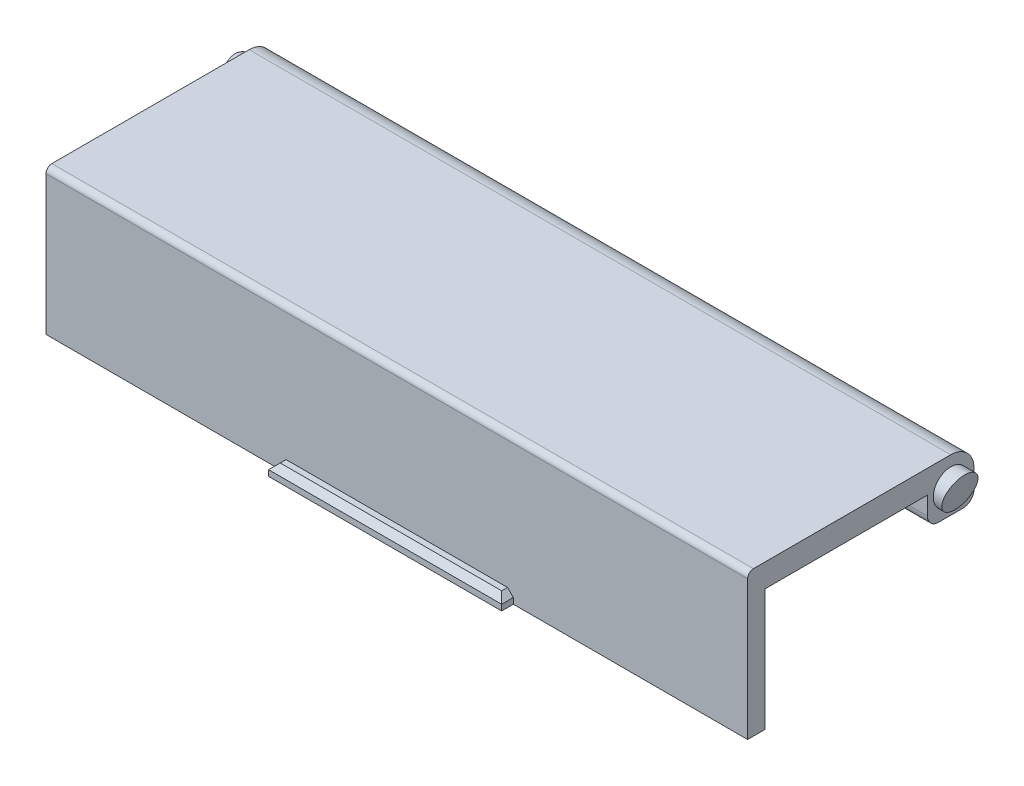
ISO-10303-21;
HEADER;
FILE_DESCRIPTION(('STEP AP214'),'2;1');
FILE_NAME('part.step','',(''),(''),'','','');
FILE_SCHEMA(('AUTOMOTIVE_DESIGN { 1 0 10303 214 1 1 1 1 }'));
ENDSEC;
DATA;
#1=APPLICATION_CONTEXT('core data for automotive mechanical design processes');
#2=APPLICATION_PROTOCOL_DEFINITION('international standard','automotive_design',2000,#1);
#3=PRODUCT_CONTEXT('',#1,'mechanical');
#4=PRODUCT('Part','Part','',(#3));
#5=PRODUCT_RELATED_PRODUCT_CATEGORY('part','',(#4));
#6=PRODUCT_DEFINITION_FORMATION('','',#4);
#7=PRODUCT_DEFINITION_CONTEXT('part definition',#1,'design');
#8=PRODUCT_DEFINITION('design','',#6,#7);
#9=PRODUCT_DEFINITION_SHAPE('','',#8);
#10=(LENGTH_UNIT() NAMED_UNIT(*) SI_UNIT(.MILLI.,.METRE.));
#11=(NAMED_UNIT(*) PLANE_ANGLE_UNIT() SI_UNIT($,.RADIAN.));
#12=(NAMED_UNIT(*) SI_UNIT($,.STERADIAN.) SOLID_ANGLE_UNIT());
#13=UNCERTAINTY_MEASURE_WITH_UNIT(LENGTH_MEASURE(1.E-05),#10,'distance_accuracy_value','');
#14=(GEOMETRIC_REPRESENTATION_CONTEXT(3) GLOBAL_UNCERTAINTY_ASSIGNED_CONTEXT((#13)) GLOBAL_UNIT_ASSIGNED_CONTEXT((#10,
#11,#12)) REPRESENTATION_CONTEXT('',''));
#15=CARTESIAN_POINT('',(0.,0.,0.));
#16=DIRECTION('',(0.,0.,1.));
#17=DIRECTION('',(1.,0.,0.));
#18=AXIS2_PLACEMENT_3D('',#15,#16,#17);
#19=CARTESIAN_POINT('',(30.099,-10.446,1.5));
#20=DIRECTION('',(0.,1.,0.));
#21=DIRECTION('',(0.,0.,1.));
#22=AXIS2_PLACEMENT_3D('',#19,#20,#21);
#23=PLANE('',#22);
#24=DIRECTION('',(0.,0.,-1.));
#25=VECTOR('',#24,1.);
#26=CARTESIAN_POINT('',(-30.099,-10.446,1.5));
#27=LINE('',#26,#25);
#28=CARTESIAN_POINT('',(-30.099,-10.446,1.5));
#29=VERTEX_POINT('',#28);
#30=CARTESIAN_POINT('',(-30.099,-10.446,0.));
#31=VERTEX_POINT('',#30);
#32=EDGE_CURVE('E214',#29,#31,#27,.T.);
#33=ORIENTED_EDGE('',*,*,#32,.T.);
#34=DIRECTION('',(-1.,0.,0.));
#35=VECTOR('',#34,1.);
#36=CARTESIAN_POINT('',(30.099,-10.446,0.));
#37=LINE('',#36,#35);
#38=CARTESIAN_POINT('',(30.099,-10.446,0.));
#39=VERTEX_POINT('',#38);
#40=EDGE_CURVE('E270',#39,#31,#37,.T.);
#41=ORIENTED_EDGE('',*,*,#40,.F.);
#42=DIRECTION('',(0.,0.,-1.));
#43=VECTOR('',#42,1.);
#44=CARTESIAN_POINT('',(30.099,-10.446,1.5));
#45=LINE('',#44,#43);
#46=CARTESIAN_POINT('',(30.099,-10.446,1.5));
#47=VERTEX_POINT('',#46);
#48=EDGE_CURVE('E215',#47,#39,#45,.T.);
#49=ORIENTED_EDGE('',*,*,#48,.F.);
#50=DIRECTION('',(-1.,0.,0.));
#51=VECTOR('',#50,1.);
#52=CARTESIAN_POINT('',(30.099,-10.446,1.5));
#53=LINE('',#52,#51);
#54=CARTESIAN_POINT('',(10.,-10.446,1.5));
#55=VERTEX_POINT('',#54);
#56=EDGE_CURVE('E189',#47,#55,#53,.T.);
#57=ORIENTED_EDGE('',*,*,#56,.T.);
#58=DIRECTION('',(0.,0.,-1.));
#59=VECTOR('',#58,1.);
#60=CARTESIAN_POINT('',(10.,-10.446,1.5));
#61=LINE('',#60,#59);
#62=CARTESIAN_POINT('',(10.,-10.446,2.5));
#63=VERTEX_POINT('',#62);
#64=EDGE_CURVE('E168',#63,#55,#61,.T.);
#65=ORIENTED_EDGE('',*,*,#64,.F.);
#66=DIRECTION('',(-1.,0.,0.));
#67=VECTOR('',#66,1.);
#68=CARTESIAN_POINT('',(10.,-10.446,2.5));
#69=LINE('',#68,#67);
#70=CARTESIAN_POINT('',(-10.,-10.446,2.5));
#71=VERTEX_POINT('',#70);
#72=EDGE_CURVE('E176',#63,#71,#69,.T.);
#73=ORIENTED_EDGE('',*,*,#72,.T.);
#74=DIRECTION('',(0.,0.,-1.));
#75=VECTOR('',#74,1.);
#76=CARTESIAN_POINT('',(-10.,-10.446,1.5));
#77=LINE('',#76,#75);
#78=CARTESIAN_POINT('',(-9.99999999999997,-10.446,1.5));
#79=VERTEX_POINT('',#78);
#80=EDGE_CURVE('E197',#71,#79,#77,.T.);
#81=ORIENTED_EDGE('',*,*,#80,.T.);
#82=EDGE_CURVE('E234',#79,#29,#53,.T.);
#83=ORIENTED_EDGE('',*,*,#82,.T.);
#84=EDGE_LOOP('',(#33,#41,#49,#57,#65,#73,#81,#83));
#85=FACE_BOUND('',#84,.T.);
#86=ADVANCED_FACE('F35',(#85),#23,.F.);
#87=CARTESIAN_POINT('',(30.099,-10.446,0.));
#88=DIRECTION('',(0.,0.,1.));
#89=DIRECTION('',(1.,0.,0.));
#90=AXIS2_PLACEMENT_3D('',#87,#88,#89);
#91=PLANE('',#90);
#92=DIRECTION('',(0.,1.,0.));
#93=VECTOR('',#92,1.);
#94=CARTESIAN_POINT('',(-30.099,-10.446,0.));
#95=LINE('',#94,#93);
#96=CARTESIAN_POINT('',(-30.099,0.,0.));
#97=VERTEX_POINT('',#96);
#98=EDGE_CURVE('E236',#31,#97,#95,.T.);
#99=ORIENTED_EDGE('',*,*,#98,.T.);
#100=DIRECTION('',(-1.,0.,0.));
#101=VECTOR('',#100,1.);
#102=CARTESIAN_POINT('',(30.099,0.,0.));
#103=LINE('',#102,#101);
#104=CARTESIAN_POINT('',(30.099,0.,0.));
#105=VERTEX_POINT('',#104);
#106=EDGE_CURVE('E272',#105,#97,#103,.T.);
#107=ORIENTED_EDGE('',*,*,#106,.F.);
#108=DIRECTION('',(0.,1.,0.));
#109=VECTOR('',#108,1.);
#110=CARTESIAN_POINT('',(30.099,-10.446,0.));
#111=LINE('',#110,#109);
#112=EDGE_CURVE('E218',#39,#105,#111,.T.);
#113=ORIENTED_EDGE('',*,*,#112,.F.);
#114=ORIENTED_EDGE('',*,*,#40,.T.);
#115=EDGE_LOOP('',(#99,#107,#113,#114));
#116=FACE_BOUND('',#115,.T.);
#117=ADVANCED_FACE('F362',(#116),#91,.F.);
#118=CARTESIAN_POINT('',(30.099,0.,0.));
#119=DIRECTION('',(0.,1.,0.));
#120=DIRECTION('',(0.,0.,1.));
#121=AXIS2_PLACEMENT_3D('',#118,#119,#120);
#122=PLANE('',#121);
#123=DIRECTION('',(0.,0.,-1.));
#124=VECTOR('',#123,1.);
#125=CARTESIAN_POINT('',(-30.099,0.,0.));
#126=LINE('',#125,#124);
#127=CARTESIAN_POINT('',(-30.099,0.,-13.931));
#128=VERTEX_POINT('',#127);
#129=EDGE_CURVE('E238',#97,#128,#126,.T.);
#130=ORIENTED_EDGE('',*,*,#129,.T.);
#131=DIRECTION('',(-1.,0.,0.));
#132=VECTOR('',#131,1.);
#133=CARTESIAN_POINT('',(30.099,0.,-13.931));
#134=LINE('',#133,#132);
#135=CARTESIAN_POINT('',(30.099,0.,-13.931));
#136=VERTEX_POINT('',#135);
#137=EDGE_CURVE('E253',#136,#128,#134,.T.);
#138=ORIENTED_EDGE('',*,*,#137,.F.);
#139=DIRECTION('',(0.,0.,-1.));
#140=VECTOR('',#139,1.);
#141=CARTESIAN_POINT('',(30.099,0.,0.));
#142=LINE('',#141,#140);
#143=EDGE_CURVE('E221',#105,#136,#142,.T.);
#144=ORIENTED_EDGE('',*,*,#143,.F.);
#145=ORIENTED_EDGE('',*,*,#106,.T.);
#146=EDGE_LOOP('',(#130,#138,#144,#145));
#147=FACE_BOUND('',#146,.T.);
#148=ADVANCED_FACE('F396',(#147),#122,.F.);
#149=CARTESIAN_POINT('',(30.099,0.,-13.931));
#150=DIRECTION('',(0.,0.,-1.));
#151=DIRECTION('',(-1.,0.,0.));
#152=AXIS2_PLACEMENT_3D('',#149,#150,#151);
#153=PLANE('',#152);
#154=DIRECTION('',(0.,-1.,0.));
#155=VECTOR('',#154,1.);
#156=CARTESIAN_POINT('',(-30.099,0.,-13.931));
#157=LINE('',#156,#155);
#158=CARTESIAN_POINT('',(-30.099,-1.5475,-13.931));
#159=VERTEX_POINT('',#158);
#160=EDGE_CURVE('E240',#128,#159,#157,.T.);
#161=ORIENTED_EDGE('',*,*,#160,.T.);
#162=DIRECTION('',(-1.,0.,0.));
#163=VECTOR('',#162,1.);
#164=CARTESIAN_POINT('',(30.099,-1.5475,-13.931));
#165=LINE('',#164,#163);
#166=CARTESIAN_POINT('',(30.099,-1.5475,-13.931));
#167=VERTEX_POINT('',#166);
#168=EDGE_CURVE('E58',#159,#167,#165,.F.);
#169=ORIENTED_EDGE('',*,*,#168,.T.);
#170=DIRECTION('',(0.,-1.,0.));
#171=VECTOR('',#170,1.);
#172=CARTESIAN_POINT('',(30.099,0.,-13.931));
#173=LINE('',#172,#171);
#174=EDGE_CURVE('E223',#136,#167,#173,.T.);
#175=ORIENTED_EDGE('',*,*,#174,.F.);
#176=ORIENTED_EDGE('',*,*,#137,.T.);
#177=EDGE_LOOP('',(#161,#169,#175,#176));
#178=FACE_BOUND('',#177,.T.);
#179=ADVANCED_FACE('F281',(#178),#153,.F.);
#180=CARTESIAN_POINT('',(30.099,-2.5,-13.931));
#181=DIRECTION('',(0.,1.,0.));
#182=DIRECTION('',(0.,0.,1.));
#183=AXIS2_PLACEMENT_3D('',#180,#181,#182);
#184=PLANE('',#183);
#185=DIRECTION('',(0.,0.,-1.));
#186=VECTOR('',#185,1.);
#187=CARTESIAN_POINT('',(30.099,-2.5,-13.931));
#188=LINE('',#187,#186);
#189=CARTESIAN_POINT('',(30.099,-2.5,-14.8835));
#190=VERTEX_POINT('',#189);
#191=CARTESIAN_POINT('',(30.099,-2.5,-16.9785));
#192=VERTEX_POINT('',#191);
#193=EDGE_CURVE('E225',#190,#192,#188,.T.);
#194=ORIENTED_EDGE('',*,*,#193,.F.);
#195=DIRECTION('',(-1.,0.,0.));
#196=VECTOR('',#195,1.);
#197=CARTESIAN_POINT('',(30.099,-2.5,-14.8835));
#198=LINE('',#197,#196);
#199=CARTESIAN_POINT('',(-30.099,-2.5,-14.8835));
#200=VERTEX_POINT('',#199);
#201=EDGE_CURVE('E292',#190,#200,#198,.T.);
#202=ORIENTED_EDGE('',*,*,#201,.T.);
#203=DIRECTION('',(0.,0.,-1.));
#204=VECTOR('',#203,1.);
#205=CARTESIAN_POINT('',(-30.099,-2.5,-13.931));
#206=LINE('',#205,#204);
#207=CARTESIAN_POINT('',(-30.099,-2.5,-16.9785));
#208=VERTEX_POINT('',#207);
#209=EDGE_CURVE('E242',#200,#208,#206,.T.);
#210=ORIENTED_EDGE('',*,*,#209,.T.);
#211=DIRECTION('',(-1.,0.,0.));
#212=VECTOR('',#211,1.);
#213=CARTESIAN_POINT('',(30.099,-2.5,-16.9785));
#214=LINE('',#213,#212);
#215=EDGE_CURVE('E302',#208,#192,#214,.F.);
#216=ORIENTED_EDGE('',*,*,#215,.T.);
#217=EDGE_LOOP('',(#194,#202,#210,#216));
#218=FACE_BOUND('',#217,.T.);
#219=ADVANCED_FACE('F300',(#218),#184,.F.);
#220=CARTESIAN_POINT('',(30.099,-2.5,-17.931));
#221=DIRECTION('',(0.,0.,1.));
#222=DIRECTION('',(1.,0.,0.));
#223=AXIS2_PLACEMENT_3D('',#220,#221,#222);
#224=PLANE('',#223);
#225=DIRECTION('',(0.,1.,0.));
#226=VECTOR('',#225,1.);
#227=CARTESIAN_POINT('',(30.099,-2.5,-17.931));
#228=LINE('',#227,#226);
#229=CARTESIAN_POINT('',(30.099,-1.5475,-17.931));
#230=VERTEX_POINT('',#229);
#231=CARTESIAN_POINT('',(30.099,0.,-17.931));
#232=VERTEX_POINT('',#231);
#233=EDGE_CURVE('E227',#230,#232,#228,.T.);
#234=ORIENTED_EDGE('',*,*,#233,.F.);
#235=DIRECTION('',(-1.,0.,0.));
#236=VECTOR('',#235,1.);
#237=CARTESIAN_POINT('',(30.099,-1.5475,-17.931));
#238=LINE('',#237,#236);
#239=CARTESIAN_POINT('',(-30.099,-1.5475,-17.931));
#240=VERTEX_POINT('',#239);
#241=EDGE_CURVE('E11',#230,#240,#238,.T.);
#242=ORIENTED_EDGE('',*,*,#241,.T.);
#243=DIRECTION('',(0.,1.,0.));
#244=VECTOR('',#243,1.);
#245=CARTESIAN_POINT('',(-30.099,-2.5,-17.931));
#246=LINE('',#245,#244);
#247=CARTESIAN_POINT('',(-30.099,0.,-17.931));
#248=VERTEX_POINT('',#247);
#249=EDGE_CURVE('E245',#240,#248,#246,.T.);
#250=ORIENTED_EDGE('',*,*,#249,.T.);
#251=DIRECTION('',(-1.,0.,0.));
#252=VECTOR('',#251,1.);
#253=CARTESIAN_POINT('',(30.099,0.,-17.931));
#254=LINE('',#253,#252);
#255=EDGE_CURVE('E261',#248,#232,#254,.F.);
#256=ORIENTED_EDGE('',*,*,#255,.T.);
#257=EDGE_LOOP('',(#234,#242,#250,#256));
#258=FACE_BOUND('',#257,.T.);
#259=ADVANCED_FACE('F379',(#258),#224,.F.);
#260=CARTESIAN_POINT('',(30.099,2.,-17.931));
#261=DIRECTION('',(0.,-1.,0.));
#262=DIRECTION('',(0.,0.,-1.));
#263=AXIS2_PLACEMENT_3D('',#260,#261,#262);
#264=PLANE('',#263);
#265=DIRECTION('',(0.,0.,1.));
#266=VECTOR('',#265,1.);
#267=CARTESIAN_POINT('',(-30.099,2.,-17.931));
#268=LINE('',#267,#266);
#269=CARTESIAN_POINT('',(-30.099,2.,-15.931));
#270=VERTEX_POINT('',#269);
#271=CARTESIAN_POINT('',(-30.099,2.,0.999999999999994));
#272=VERTEX_POINT('',#271);
#273=EDGE_CURVE('E247',#270,#272,#268,.T.);
#274=ORIENTED_EDGE('',*,*,#273,.T.);
#275=DIRECTION('',(-1.,0.,0.));
#276=VECTOR('',#275,1.);
#277=CARTESIAN_POINT('',(30.099,2.,1.));
#278=LINE('',#277,#276);
#279=CARTESIAN_POINT('',(30.099,2.,0.999999999999994));
#280=VERTEX_POINT('',#279);
#281=EDGE_CURVE('E308',#272,#280,#278,.F.);
#282=ORIENTED_EDGE('',*,*,#281,.T.);
#283=DIRECTION('',(0.,0.,1.));
#284=VECTOR('',#283,1.);
#285=CARTESIAN_POINT('',(30.099,2.,-17.931));
#286=LINE('',#285,#284);
#287=CARTESIAN_POINT('',(30.099,2.,-15.931));
#288=VERTEX_POINT('',#287);
#289=EDGE_CURVE('E229',#288,#280,#286,.T.);
#290=ORIENTED_EDGE('',*,*,#289,.F.);
#291=DIRECTION('',(-1.,0.,0.));
#292=VECTOR('',#291,1.);
#293=CARTESIAN_POINT('',(30.099,2.,-15.931));
#294=LINE('',#293,#292);
#295=EDGE_CURVE('E267',#288,#270,#294,.T.);
#296=ORIENTED_EDGE('',*,*,#295,.T.);
#297=EDGE_LOOP('',(#274,#282,#290,#296));
#298=FACE_BOUND('',#297,.T.);
#299=ADVANCED_FACE('F370',(#298),#264,.F.);
#300=CARTESIAN_POINT('',(30.099,2.,1.5));
#301=DIRECTION('',(0.,0.,-1.));
#302=DIRECTION('',(-1.,0.,0.));
#303=AXIS2_PLACEMENT_3D('',#300,#301,#302);
#304=PLANE('',#303);
#305=DIRECTION('',(0.,-1.,0.));
#306=VECTOR('',#305,1.);
#307=CARTESIAN_POINT('',(30.099,2.,1.5));
#308=LINE('',#307,#306);
#309=CARTESIAN_POINT('',(30.099,1.5,1.5));
#310=VERTEX_POINT('',#309);
#311=EDGE_CURVE('E232',#310,#47,#308,.T.);
#312=ORIENTED_EDGE('',*,*,#311,.F.);
#313=DIRECTION('',(-1.,0.,0.));
#314=VECTOR('',#313,1.);
#315=CARTESIAN_POINT('',(30.099,1.5,1.5));
#316=LINE('',#315,#314);
#317=CARTESIAN_POINT('',(-30.099,1.5,1.5));
#318=VERTEX_POINT('',#317);
#319=EDGE_CURVE('E312',#310,#318,#316,.T.);
#320=ORIENTED_EDGE('',*,*,#319,.T.);
#321=DIRECTION('',(0.,-1.,0.));
#322=VECTOR('',#321,1.);
#323=CARTESIAN_POINT('',(-30.099,2.,1.5));
#324=LINE('',#323,#322);
#325=EDGE_CURVE('E219',#318,#29,#324,.T.);
#326=ORIENTED_EDGE('',*,*,#325,.T.);
#327=ORIENTED_EDGE('',*,*,#82,.F.);
#328=DIRECTION('',(0.,1.,0.));
#329=VECTOR('',#328,1.);
#330=CARTESIAN_POINT('',(-10.,-10.446,1.5));
#331=LINE('',#330,#329);
#332=CARTESIAN_POINT('',(-10.,-9.946,1.5));
#333=VERTEX_POINT('',#332);
#334=EDGE_CURVE('E201',#79,#333,#331,.T.);
#335=ORIENTED_EDGE('',*,*,#334,.T.);
#336=DIRECTION('',(-0.707106781186547,-0.707106781186547,0.));
#337=VECTOR('',#336,1.);
#338=CARTESIAN_POINT('',(16.0225,16.0765,1.5));
#339=LINE('',#338,#337);
#340=CARTESIAN_POINT('',(-9.5,-9.446,1.5));
#341=VERTEX_POINT('',#340);
#342=EDGE_CURVE('E324',#333,#341,#339,.F.);
#343=ORIENTED_EDGE('',*,*,#342,.T.);
#344=DIRECTION('',(-1.,0.,0.));
#345=VECTOR('',#344,1.);
#346=CARTESIAN_POINT('',(10.,-9.446,1.5));
#347=LINE('',#346,#345);
#348=CARTESIAN_POINT('',(9.5,-9.446,1.5));
#349=VERTEX_POINT('',#348);
#350=EDGE_CURVE('E183',#349,#341,#347,.T.);
#351=ORIENTED_EDGE('',*,*,#350,.F.);
#352=DIRECTION('',(0.707106781186547,-0.707106781186547,0.));
#353=VECTOR('',#352,1.);
#354=CARTESIAN_POINT('',(14.0765,-14.0225,1.5));
#355=LINE('',#354,#353);
#356=CARTESIAN_POINT('',(10.,-9.946,1.5));
#357=VERTEX_POINT('',#356);
#358=EDGE_CURVE('E315',#349,#357,#355,.T.);
#359=ORIENTED_EDGE('',*,*,#358,.T.);
#360=DIRECTION('',(0.,1.,0.));
#361=VECTOR('',#360,1.);
#362=CARTESIAN_POINT('',(10.,-10.446,1.5));
#363=LINE('',#362,#361);
#364=EDGE_CURVE('E173',#55,#357,#363,.T.);
#365=ORIENTED_EDGE('',*,*,#364,.F.);
#366=ORIENTED_EDGE('',*,*,#56,.F.);
#367=EDGE_LOOP('',(#312,#320,#326,#327,#335,#343,#351,#359,#365,#366));
#368=FACE_BOUND('',#367,.T.);
#369=ADVANCED_FACE('F356',(#368),#304,.F.);
#370=CARTESIAN_POINT('',(30.099,0.,0.));
#371=DIRECTION('',(1.,0.,0.));
#372=DIRECTION('',(0.,0.,-1.));
#373=AXIS2_PLACEMENT_3D('',#370,#371,#372);
#374=PLANE('',#373);
#375=CARTESIAN_POINT('',(30.099,-0.4,-15.931));
#376=DIRECTION('',(1.,0.,0.));
#377=DIRECTION('',(0.,0.,-1.));
#378=AXIS2_PLACEMENT_3D('',#375,#376,#377);
#379=CIRCLE('',#378,1.5);
#380=CARTESIAN_POINT('',(30.099,-0.4,-17.431));
#381=VERTEX_POINT('',#380);
#382=EDGE_CURVE('E205',#381,#381,#379,.T.);
#383=ORIENTED_EDGE('',*,*,#382,.F.);
#384=EDGE_LOOP('',(#383));
#385=FACE_BOUND('',#384,.T.);
#386=ORIENTED_EDGE('',*,*,#174,.T.);
#387=CARTESIAN_POINT('',(30.099,-1.5475,-14.8835));
#388=DIRECTION('',(1.,0.,0.));
#389=DIRECTION('',(0.,0.,-1.));
#390=AXIS2_PLACEMENT_3D('',#387,#388,#389);
#391=CIRCLE('',#390,0.9525);
#392=EDGE_CURVE('E43',#167,#190,#391,.T.);
#393=ORIENTED_EDGE('',*,*,#392,.T.);
#394=ORIENTED_EDGE('',*,*,#193,.T.);
#395=CARTESIAN_POINT('',(30.099,-1.5475,-16.9785));
#396=DIRECTION('',(1.,0.,0.));
#397=DIRECTION('',(0.,0.,-1.));
#398=AXIS2_PLACEMENT_3D('',#395,#396,#397);
#399=CIRCLE('',#398,0.9525);
#400=EDGE_CURVE('E50',#192,#230,#399,.T.);
#401=ORIENTED_EDGE('',*,*,#400,.T.);
#402=ORIENTED_EDGE('',*,*,#233,.T.);
#403=CARTESIAN_POINT('',(30.099,0.,-15.931));
#404=DIRECTION('',(1.,0.,0.));
#405=DIRECTION('',(0.,0.,-1.));
#406=AXIS2_PLACEMENT_3D('',#403,#404,#405);
#407=CIRCLE('',#406,2.);
#408=EDGE_CURVE('E259',#232,#288,#407,.T.);
#409=ORIENTED_EDGE('',*,*,#408,.T.);
#410=ORIENTED_EDGE('',*,*,#289,.T.);
#411=CARTESIAN_POINT('',(30.099,1.5,1.));
#412=DIRECTION('',(1.,0.,0.));
#413=DIRECTION('',(0.,0.,-1.));
#414=AXIS2_PLACEMENT_3D('',#411,#412,#413);
#415=CIRCLE('',#414,0.5);
#416=EDGE_CURVE('E304',#280,#310,#415,.T.);
#417=ORIENTED_EDGE('',*,*,#416,.T.);
#418=ORIENTED_EDGE('',*,*,#311,.T.);
#419=ORIENTED_EDGE('',*,*,#48,.T.);
#420=ORIENTED_EDGE('',*,*,#112,.T.);
#421=ORIENTED_EDGE('',*,*,#143,.T.);
#422=EDGE_LOOP('',(#386,#393,#394,#401,#402,#409,#410,#417,#418,#419,#420,#421));
#423=FACE_BOUND('',#422,.T.);
#424=ADVANCED_FACE('F298',(#385,#423),#374,.T.);
#425=CARTESIAN_POINT('',(-30.099,0.,0.));
#426=DIRECTION('',(1.,0.,0.));
#427=DIRECTION('',(0.,0.,-1.));
#428=AXIS2_PLACEMENT_3D('',#425,#426,#427);
#429=PLANE('',#428);
#430=CARTESIAN_POINT('',(-30.099,-0.4,-15.931));
#431=DIRECTION('',(1.,0.,0.));
#432=DIRECTION('',(0.,0.,-1.));
#433=AXIS2_PLACEMENT_3D('',#430,#431,#432);
#434=CIRCLE('',#433,1.5);
#435=CARTESIAN_POINT('',(-30.099,-0.4,-17.431));
#436=VERTEX_POINT('',#435);
#437=EDGE_CURVE('E319',#436,#436,#434,.T.);
#438=ORIENTED_EDGE('',*,*,#437,.T.);
#439=EDGE_LOOP('',(#438));
#440=FACE_BOUND('',#439,.T.);
#441=ORIENTED_EDGE('',*,*,#209,.F.);
#442=CARTESIAN_POINT('',(-30.099,-1.5475,-14.8835));
#443=DIRECTION('',(1.,0.,0.));
#444=DIRECTION('',(0.,0.,-1.));
#445=AXIS2_PLACEMENT_3D('',#442,#443,#444);
#446=CIRCLE('',#445,0.9525);
#447=EDGE_CURVE('E285',#200,#159,#446,.F.);
#448=ORIENTED_EDGE('',*,*,#447,.T.);
#449=ORIENTED_EDGE('',*,*,#160,.F.);
#450=ORIENTED_EDGE('',*,*,#129,.F.);
#451=ORIENTED_EDGE('',*,*,#98,.F.);
#452=ORIENTED_EDGE('',*,*,#32,.F.);
#453=ORIENTED_EDGE('',*,*,#325,.F.);
#454=CARTESIAN_POINT('',(-30.099,1.5,1.));
#455=DIRECTION('',(1.,0.,0.));
#456=DIRECTION('',(0.,0.,-1.));
#457=AXIS2_PLACEMENT_3D('',#454,#455,#456);
#458=CIRCLE('',#457,0.5);
#459=EDGE_CURVE('E310',#318,#272,#458,.F.);
#460=ORIENTED_EDGE('',*,*,#459,.T.);
#461=ORIENTED_EDGE('',*,*,#273,.F.);
#462=CARTESIAN_POINT('',(-30.099,0.,-15.931));
#463=DIRECTION('',(1.,0.,0.));
#464=DIRECTION('',(0.,0.,-1.));
#465=AXIS2_PLACEMENT_3D('',#462,#463,#464);
#466=CIRCLE('',#465,2.);
#467=EDGE_CURVE('E264',#270,#248,#466,.F.);
#468=ORIENTED_EDGE('',*,*,#467,.T.);
#469=ORIENTED_EDGE('',*,*,#249,.F.);
#470=CARTESIAN_POINT('',(-30.099,-1.5475,-16.9785));
#471=DIRECTION('',(1.,0.,0.));
#472=DIRECTION('',(0.,0.,-1.));
#473=AXIS2_PLACEMENT_3D('',#470,#471,#472);
#474=CIRCLE('',#473,0.9525);
#475=EDGE_CURVE('E289',#240,#208,#474,.F.);
#476=ORIENTED_EDGE('',*,*,#475,.T.);
#477=EDGE_LOOP('',(#441,#448,#449,#450,#451,#452,#453,#460,#461,#468,#469,#476));
#478=FACE_BOUND('',#477,.T.);
#479=ADVANCED_FACE('F284',(#440,#478),#429,.F.);
#480=CARTESIAN_POINT('',(30.099,0.,-15.931));
#481=DIRECTION('',(-1.,0.,0.));
#482=DIRECTION('',(0.,0.,1.));
#483=AXIS2_PLACEMENT_3D('',#480,#481,#482);
#484=CYLINDRICAL_SURFACE('',#483,2.);
#485=ORIENTED_EDGE('',*,*,#408,.F.);
#486=ORIENTED_EDGE('',*,*,#255,.F.);
#487=ORIENTED_EDGE('',*,*,#467,.F.);
#488=ORIENTED_EDGE('',*,*,#295,.F.);
#489=EDGE_LOOP('',(#485,#486,#487,#488));
#490=FACE_BOUND('',#489,.T.);
#491=ADVANCED_FACE('F375',(#490),#484,.T.);
#492=CARTESIAN_POINT('',(10.,-9.446,1.5));
#493=DIRECTION('',(0.,-1.,0.));
#494=DIRECTION('',(0.,0.,-1.));
#495=AXIS2_PLACEMENT_3D('',#492,#493,#494);
#496=PLANE('',#495);
#497=ORIENTED_EDGE('',*,*,#350,.T.);
#498=DIRECTION('',(0.,0.,1.));
#499=VECTOR('',#498,1.);
#500=CARTESIAN_POINT('',(-9.5,-9.446,1.5));
#501=LINE('',#500,#499);
#502=CARTESIAN_POINT('',(-9.5,-9.446,2.));
#503=VERTEX_POINT('',#502);
#504=EDGE_CURVE('E331',#341,#503,#501,.T.);
#505=ORIENTED_EDGE('',*,*,#504,.T.);
#506=DIRECTION('',(1.,0.,0.));
#507=VECTOR('',#506,1.);
#508=CARTESIAN_POINT('',(10.,-9.446,2.));
#509=LINE('',#508,#507);
#510=CARTESIAN_POINT('',(9.5,-9.446,2.));
#511=VERTEX_POINT('',#510);
#512=EDGE_CURVE('E206',#503,#511,#509,.T.);
#513=ORIENTED_EDGE('',*,*,#512,.T.);
#514=DIRECTION('',(0.,0.,-1.));
#515=VECTOR('',#514,1.);
#516=CARTESIAN_POINT('',(9.5,-9.446,1.5));
#517=LINE('',#516,#515);
#518=EDGE_CURVE('E333',#511,#349,#517,.T.);
#519=ORIENTED_EDGE('',*,*,#518,.T.);
#520=EDGE_LOOP('',(#497,#505,#513,#519));
#521=FACE_BOUND('',#520,.T.);
#522=ADVANCED_FACE('F338',(#521),#496,.F.);
#523=CARTESIAN_POINT('',(10.,-10.446,2.5));
#524=DIRECTION('',(0.,0.,-1.));
#525=DIRECTION('',(-1.,0.,0.));
#526=AXIS2_PLACEMENT_3D('',#523,#524,#525);
#527=PLANE('',#526);
#528=DIRECTION('',(0.,-1.,0.));
#529=VECTOR('',#528,1.);
#530=CARTESIAN_POINT('',(10.,-10.446,2.5));
#531=LINE('',#530,#529);
#532=CARTESIAN_POINT('',(10.,-9.946,2.5));
#533=VERTEX_POINT('',#532);
#534=EDGE_CURVE('E163',#533,#63,#531,.T.);
#535=ORIENTED_EDGE('',*,*,#534,.F.);
#536=DIRECTION('',(-1.,0.,0.));
#537=VECTOR('',#536,1.);
#538=CARTESIAN_POINT('',(10.,-9.946,2.5));
#539=LINE('',#538,#537);
#540=CARTESIAN_POINT('',(-10.,-9.946,2.5));
#541=VERTEX_POINT('',#540);
#542=EDGE_CURVE('E326',#533,#541,#539,.T.);
#543=ORIENTED_EDGE('',*,*,#542,.T.);
#544=DIRECTION('',(0.,-1.,0.));
#545=VECTOR('',#544,1.);
#546=CARTESIAN_POINT('',(-10.,-10.446,2.5));
#547=LINE('',#546,#545);
#548=EDGE_CURVE('E179',#541,#71,#547,.T.);
#549=ORIENTED_EDGE('',*,*,#548,.T.);
#550=ORIENTED_EDGE('',*,*,#72,.F.);
#551=EDGE_LOOP('',(#535,#543,#549,#550));
#552=FACE_BOUND('',#551,.T.);
#553=ADVANCED_FACE('F177',(#552),#527,.F.);
#554=CARTESIAN_POINT('',(10.,0.,0.));
#555=DIRECTION('',(1.,0.,0.));
#556=DIRECTION('',(0.,0.,-1.));
#557=AXIS2_PLACEMENT_3D('',#554,#555,#556);
#558=PLANE('',#557);
#559=ORIENTED_EDGE('',*,*,#364,.T.);
#560=DIRECTION('',(0.,0.,1.));
#561=VECTOR('',#560,1.);
#562=CARTESIAN_POINT('',(10.,-9.946,2.5));
#563=LINE('',#562,#561);
#564=EDGE_CURVE('E170',#357,#533,#563,.T.);
#565=ORIENTED_EDGE('',*,*,#564,.T.);
#566=ORIENTED_EDGE('',*,*,#534,.T.);
#567=ORIENTED_EDGE('',*,*,#64,.T.);
#568=EDGE_LOOP('',(#559,#565,#566,#567));
#569=FACE_BOUND('',#568,.T.);
#570=ADVANCED_FACE('F166',(#569),#558,.T.);
#571=CARTESIAN_POINT('',(-10.,0.,0.));
#572=DIRECTION('',(1.,0.,0.));
#573=DIRECTION('',(0.,0.,-1.));
#574=AXIS2_PLACEMENT_3D('',#571,#572,#573);
#575=PLANE('',#574);
#576=ORIENTED_EDGE('',*,*,#548,.F.);
#577=DIRECTION('',(0.,0.,-1.));
#578=VECTOR('',#577,1.);
#579=CARTESIAN_POINT('',(-10.,-9.946,0.));
#580=LINE('',#579,#578);
#581=EDGE_CURVE('E329',#541,#333,#580,.T.);
#582=ORIENTED_EDGE('',*,*,#581,.T.);
#583=ORIENTED_EDGE('',*,*,#334,.F.);
#584=ORIENTED_EDGE('',*,*,#80,.F.);
#585=EDGE_LOOP('',(#576,#582,#583,#584));
#586=FACE_BOUND('',#585,.T.);
#587=ADVANCED_FACE('F349',(#586),#575,.F.);
#588=CARTESIAN_POINT('',(31.299,-0.4,-15.931));
#589=DIRECTION('',(-1.,0.,0.));
#590=DIRECTION('',(0.,0.,1.));
#591=AXIS2_PLACEMENT_3D('',#588,#589,#590);
#592=CYLINDRICAL_SURFACE('',#591,1.5);
#593=CARTESIAN_POINT('',(30.8827009228166,-0.4,-15.931));
#594=DIRECTION('',(-0.963578778919478,0.267424637638435,0.));
#595=DIRECTION('',(-0.267424637638435,-0.963578778919478,0.));
#596=AXIS2_PLACEMENT_3D('',#593,#594,#595);
#597=ELLIPSE('',#596,1.55669679824419,1.5);
#598=CARTESIAN_POINT('',(30.4664018456333,-1.9,-15.931));
#599=VERTEX_POINT('',#598);
#600=EDGE_CURVE('E322',#599,#599,#597,.T.);
#601=ORIENTED_EDGE('',*,*,#600,.T.);
#602=EDGE_LOOP('',(#601));
#603=FACE_BOUND('',#602,.T.);
#604=ORIENTED_EDGE('',*,*,#382,.T.);
#605=EDGE_LOOP('',(#604));
#606=FACE_BOUND('',#605,.T.);
#607=ADVANCED_FACE('F435',(#603,#606),#592,.T.);
#608=CARTESIAN_POINT('',(-31.299,-0.4,-15.931));
#609=DIRECTION('',(1.,0.,0.));
#610=DIRECTION('',(0.,0.,-1.));
#611=AXIS2_PLACEMENT_3D('',#608,#609,#610);
#612=CYLINDRICAL_SURFACE('',#611,1.5);
#613=CARTESIAN_POINT('',(-30.8827009228166,-0.4,-15.931));
#614=DIRECTION('',(0.963578778919478,0.267424637638436,0.));
#615=DIRECTION('',(0.267424637638436,-0.963578778919478,0.));
#616=AXIS2_PLACEMENT_3D('',#613,#614,#615);
#617=ELLIPSE('',#616,1.55669679824419,1.5);
#618=CARTESIAN_POINT('',(-30.4664018456333,-1.9,-15.931));
#619=VERTEX_POINT('',#618);
#620=EDGE_CURVE('E603',#619,#619,#617,.F.);
#621=ORIENTED_EDGE('',*,*,#620,.F.);
#622=EDGE_LOOP('',(#621));
#623=FACE_BOUND('',#622,.T.);
#624=ORIENTED_EDGE('',*,*,#437,.F.);
#625=EDGE_LOOP('',(#624));
#626=FACE_BOUND('',#625,.T.);
#627=ADVANCED_FACE('F408',(#623,#626),#612,.T.);
#628=CARTESIAN_POINT('',(10.,-9.946,0.));
#629=DIRECTION('',(0.707106781186547,0.707106781186547,0.));
#630=DIRECTION('',(0.,0.,-1.));
#631=AXIS2_PLACEMENT_3D('',#628,#629,#630);
#632=PLANE('',#631);
#633=ORIENTED_EDGE('',*,*,#358,.F.);
#634=ORIENTED_EDGE('',*,*,#518,.F.);
#635=DIRECTION('',(0.577350269189626,-0.577350269189626,0.577350269189626));
#636=VECTOR('',#635,1.);
#637=CARTESIAN_POINT('',(10.,-9.946,2.5));
#638=LINE('',#637,#636);
#639=EDGE_CURVE('E316',#533,#511,#638,.F.);
#640=ORIENTED_EDGE('',*,*,#639,.F.);
#641=ORIENTED_EDGE('',*,*,#564,.F.);
#642=EDGE_LOOP('',(#633,#634,#640,#641));
#643=FACE_BOUND('',#642,.T.);
#644=ADVANCED_FACE('F344',(#643),#632,.T.);
#645=CARTESIAN_POINT('',(10.,-9.946,2.5));
#646=DIRECTION('',(0.,-0.707106781186547,-0.707106781186547));
#647=DIRECTION('',(-1.,0.,0.));
#648=AXIS2_PLACEMENT_3D('',#645,#646,#647);
#649=PLANE('',#648);
#650=ORIENTED_EDGE('',*,*,#639,.T.);
#651=ORIENTED_EDGE('',*,*,#512,.F.);
#652=DIRECTION('',(-0.577350269189626,-0.577350269189626,0.577350269189626));
#653=VECTOR('',#652,1.);
#654=CARTESIAN_POINT('',(-3.33333333333333,-3.27933333333334,-4.16666666666667));
#655=LINE('',#654,#653);
#656=EDGE_CURVE('E320',#541,#503,#655,.F.);
#657=ORIENTED_EDGE('',*,*,#656,.F.);
#658=ORIENTED_EDGE('',*,*,#542,.F.);
#659=EDGE_LOOP('',(#650,#651,#657,#658));
#660=FACE_BOUND('',#659,.T.);
#661=ADVANCED_FACE('F346',(#660),#649,.F.);
#662=CARTESIAN_POINT('',(-9.5,-9.446,1.5));
#663=DIRECTION('',(0.707106781186547,-0.707106781186547,0.));
#664=DIRECTION('',(0.,0.,1.));
#665=AXIS2_PLACEMENT_3D('',#662,#663,#664);
#666=PLANE('',#665);
#667=ORIENTED_EDGE('',*,*,#342,.F.);
#668=ORIENTED_EDGE('',*,*,#581,.F.);
#669=ORIENTED_EDGE('',*,*,#656,.T.);
#670=ORIENTED_EDGE('',*,*,#504,.F.);
#671=EDGE_LOOP('',(#667,#668,#669,#670));
#672=FACE_BOUND('',#671,.T.);
#673=ADVANCED_FACE('F353',(#672),#666,.F.);
#674=CARTESIAN_POINT('',(30.099,1.5,1.));
#675=DIRECTION('',(-1.,0.,0.));
#676=DIRECTION('',(0.,0.,1.));
#677=AXIS2_PLACEMENT_3D('',#674,#675,#676);
#678=CYLINDRICAL_SURFACE('',#677,0.5);
#679=ORIENTED_EDGE('',*,*,#416,.F.);
#680=ORIENTED_EDGE('',*,*,#281,.F.);
#681=ORIENTED_EDGE('',*,*,#459,.F.);
#682=ORIENTED_EDGE('',*,*,#319,.F.);
#683=EDGE_LOOP('',(#679,#680,#681,#682));
#684=FACE_BOUND('',#683,.T.);
#685=ADVANCED_FACE('F366',(#684),#678,.T.);
#686=CARTESIAN_POINT('',(30.099,-1.5475,-14.8835));
#687=DIRECTION('',(-1.,0.,0.));
#688=DIRECTION('',(0.,0.,1.));
#689=AXIS2_PLACEMENT_3D('',#686,#687,#688);
#690=CYLINDRICAL_SURFACE('',#689,0.9525);
#691=ORIENTED_EDGE('',*,*,#392,.F.);
#692=ORIENTED_EDGE('',*,*,#168,.F.);
#693=ORIENTED_EDGE('',*,*,#447,.F.);
#694=ORIENTED_EDGE('',*,*,#201,.F.);
#695=EDGE_LOOP('',(#691,#692,#693,#694));
#696=FACE_BOUND('',#695,.T.);
#697=ADVANCED_FACE('F303',(#696),#690,.T.);
#698=CARTESIAN_POINT('',(30.099,-1.5475,-16.9785));
#699=DIRECTION('',(-1.,0.,0.));
#700=DIRECTION('',(0.,0.,1.));
#701=AXIS2_PLACEMENT_3D('',#698,#699,#700);
#702=CYLINDRICAL_SURFACE('',#701,0.9525);
#703=ORIENTED_EDGE('',*,*,#400,.F.);
#704=ORIENTED_EDGE('',*,*,#215,.F.);
#705=ORIENTED_EDGE('',*,*,#475,.F.);
#706=ORIENTED_EDGE('',*,*,#241,.F.);
#707=EDGE_LOOP('',(#703,#704,#705,#706));
#708=FACE_BOUND('',#707,.T.);
#709=ADVANCED_FACE('F37',(#708),#702,.T.);
#710=CARTESIAN_POINT('',(30.4664018456333,-1.9,-17.931));
#711=DIRECTION('',(-0.963578778919478,0.267424637638435,0.));
#712=DIRECTION('',(-0.267424637638435,-0.963578778919478,0.));
#713=AXIS2_PLACEMENT_3D('',#710,#711,#712);
#714=PLANE('',#713);
#715=ORIENTED_EDGE('',*,*,#600,.F.);
#716=EDGE_LOOP('',(#715));
#717=FACE_BOUND('',#716,.T.);
#718=ADVANCED_FACE('F383',(#717),#714,.F.);
#719=CARTESIAN_POINT('',(-30.4664018456333,-1.9,-17.931));
#720=DIRECTION('',(0.963578778919478,0.267424637638436,0.));
#721=DIRECTION('',(-0.267424637638436,0.963578778919478,0.));
#722=AXIS2_PLACEMENT_3D('',#719,#720,#721);
#723=PLANE('',#722);
#724=ORIENTED_EDGE('',*,*,#620,.T.);
#725=EDGE_LOOP('',(#724));
#726=FACE_BOUND('',#725,.T.);
#727=ADVANCED_FACE('F388',(#726),#723,.F.);
#728=CLOSED_SHELL('',(#86,#117,#148,#179,#219,#259,#299,#369,#424,#479,#491,#522,#553,#570,#587,
#607,#627,#644,#661,#673,#685,#697,#709,#718,#727));
#729=MANIFOLD_SOLID_BREP('B2',#728);
#730=ADVANCED_BREP_SHAPE_REPRESENTATION('',(#18,#729),#14);
#731=SHAPE_DEFINITION_REPRESENTATION(#9,#730);
ENDSEC;
END-ISO-10303-21;
